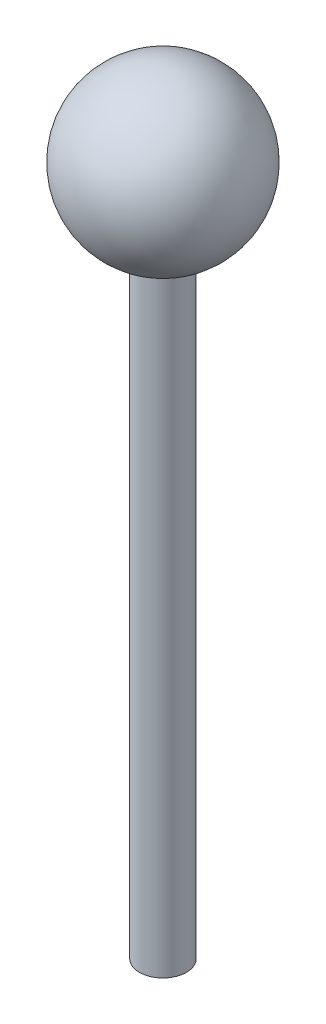
ISO-10303-21;
HEADER;
FILE_DESCRIPTION(('STEP AP214'),'2;1');
FILE_NAME('part.step','',(''),(''),'','','');
FILE_SCHEMA(('AUTOMOTIVE_DESIGN { 1 0 10303 214 1 1 1 1 }'));
ENDSEC;
DATA;
#1=APPLICATION_CONTEXT('core data for automotive mechanical design processes');
#2=APPLICATION_PROTOCOL_DEFINITION('international standard','automotive_design',2000,#1);
#3=PRODUCT_CONTEXT('',#1,'mechanical');
#4=PRODUCT('Part','Part','',(#3));
#5=PRODUCT_RELATED_PRODUCT_CATEGORY('part','',(#4));
#6=PRODUCT_DEFINITION_FORMATION('','',#4);
#7=PRODUCT_DEFINITION_CONTEXT('part definition',#1,'design');
#8=PRODUCT_DEFINITION('design','',#6,#7);
#9=PRODUCT_DEFINITION_SHAPE('','',#8);
#10=(LENGTH_UNIT() NAMED_UNIT(*) SI_UNIT(.MILLI.,.METRE.));
#11=(NAMED_UNIT(*) PLANE_ANGLE_UNIT() SI_UNIT($,.RADIAN.));
#12=(NAMED_UNIT(*) SI_UNIT($,.STERADIAN.) SOLID_ANGLE_UNIT());
#13=UNCERTAINTY_MEASURE_WITH_UNIT(LENGTH_MEASURE(1.E-05),#10,'distance_accuracy_value','');
#14=(GEOMETRIC_REPRESENTATION_CONTEXT(3) GLOBAL_UNCERTAINTY_ASSIGNED_CONTEXT((#13)) GLOBAL_UNIT_ASSIGNED_CONTEXT((#10,
#11,#12)) REPRESENTATION_CONTEXT('',''));
#15=CARTESIAN_POINT('',(0.,0.,0.));
#16=DIRECTION('',(0.,0.,1.));
#17=DIRECTION('',(1.,0.,0.));
#18=AXIS2_PLACEMENT_3D('',#15,#16,#17);
#19=CARTESIAN_POINT('',(0.,0.,0.));
#20=DIRECTION('',(0.,-1.,0.));
#21=DIRECTION('',(1.,0.,0.));
#22=AXIS2_PLACEMENT_3D('',#19,#20,#21);
#23=SPHERICAL_SURFACE('',#22,17.5);
#24=CARTESIAN_POINT('',(0.,-16.7705098312484,0.));
#25=DIRECTION('',(0.,-1.,0.));
#26=DIRECTION('',(1.,0.,0.));
#27=AXIS2_PLACEMENT_3D('',#24,#25,#26);
#28=CIRCLE('',#27,4.99999999999994);
#29=CARTESIAN_POINT('',(5.,-16.7705098312484,0.));
#30=VERTEX_POINT('',#29);
#31=EDGE_CURVE('E43',#30,#30,#28,.T.);
#32=ORIENTED_EDGE('',*,*,#31,.F.);
#33=EDGE_LOOP('',(#32));
#34=FACE_BOUND('',#33,.T.);
#35=ADVANCED_FACE('F37',(#34),#23,.T.);
#36=CARTESIAN_POINT('',(5.00000000000002,-146.770509831248,0.));
#37=DIRECTION('',(0.,-1.,0.));
#38=DIRECTION('',(1.,0.,0.));
#39=AXIS2_PLACEMENT_3D('',#36,#37,#38);
#40=PLANE('',#39);
#41=CARTESIAN_POINT('',(5.03459394414593E-13,-146.770509831248,0.));
#42=DIRECTION('',(0.,-1.,0.));
#43=DIRECTION('',(1.,0.,0.));
#44=AXIS2_PLACEMENT_3D('',#41,#42,#43);
#45=CIRCLE('',#44,4.99999999999951);
#46=CARTESIAN_POINT('',(5.00000000000002,-146.770509831248,0.));
#47=VERTEX_POINT('',#46);
#48=EDGE_CURVE('E10',#47,#47,#45,.T.);
#49=ORIENTED_EDGE('',*,*,#48,.T.);
#50=EDGE_LOOP('',(#49));
#51=FACE_BOUND('',#50,.T.);
#52=ADVANCED_FACE('F53',(#51),#40,.T.);
#53=CARTESIAN_POINT('',(3.43024899888577E-12,-1000.,0.));
#54=DIRECTION('',(0.,-1.,0.));
#55=DIRECTION('',(1.,0.,0.));
#56=AXIS2_PLACEMENT_3D('',#53,#54,#55);
#57=CYLINDRICAL_SURFACE('',#56,4.99999999999973);
#58=ORIENTED_EDGE('',*,*,#31,.T.);
#59=EDGE_LOOP('',(#58));
#60=FACE_BOUND('',#59,.T.);
#61=ORIENTED_EDGE('',*,*,#48,.F.);
#62=EDGE_LOOP('',(#61));
#63=FACE_BOUND('',#62,.T.);
#64=ADVANCED_FACE('F49',(#60,#63),#57,.T.);
#65=CLOSED_SHELL('',(#35,#52,#64));
#66=MANIFOLD_SOLID_BREP('B2',#65);
#67=ADVANCED_BREP_SHAPE_REPRESENTATION('',(#18,#66),#14);
#68=SHAPE_DEFINITION_REPRESENTATION(#9,#67);
ENDSEC;
END-ISO-10303-21;
